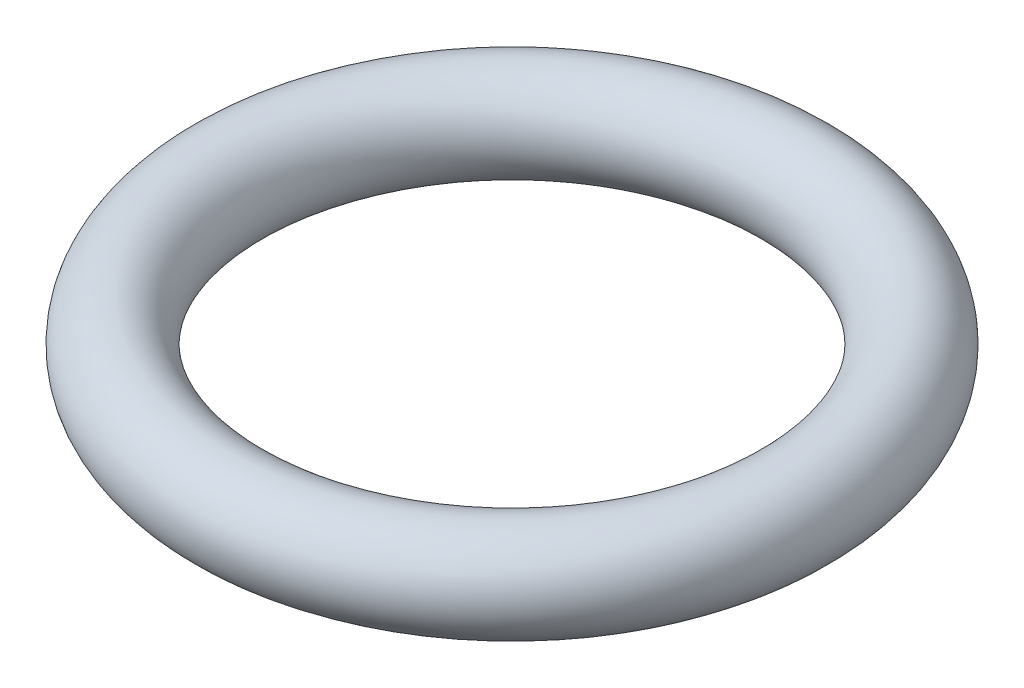
ISO-10303-21;
HEADER;
FILE_DESCRIPTION(('STEP AP214'),'2;1');
FILE_NAME('part.step','',(''),(''),'','','');
FILE_SCHEMA(('AUTOMOTIVE_DESIGN { 1 0 10303 214 1 1 1 1 }'));
ENDSEC;
DATA;
#1=APPLICATION_CONTEXT('core data for automotive mechanical design processes');
#2=APPLICATION_PROTOCOL_DEFINITION('international standard','automotive_design',2000,#1);
#3=PRODUCT_CONTEXT('',#1,'mechanical');
#4=PRODUCT('Part','Part','',(#3));
#5=PRODUCT_RELATED_PRODUCT_CATEGORY('part','',(#4));
#6=PRODUCT_DEFINITION_FORMATION('','',#4);
#7=PRODUCT_DEFINITION_CONTEXT('part definition',#1,'design');
#8=PRODUCT_DEFINITION('design','',#6,#7);
#9=PRODUCT_DEFINITION_SHAPE('','',#8);
#10=(LENGTH_UNIT() NAMED_UNIT(*) SI_UNIT(.MILLI.,.METRE.));
#11=(NAMED_UNIT(*) PLANE_ANGLE_UNIT() SI_UNIT($,.RADIAN.));
#12=(NAMED_UNIT(*) SI_UNIT($,.STERADIAN.) SOLID_ANGLE_UNIT());
#13=UNCERTAINTY_MEASURE_WITH_UNIT(LENGTH_MEASURE(1.E-05),#10,'distance_accuracy_value','');
#14=(GEOMETRIC_REPRESENTATION_CONTEXT(3) GLOBAL_UNCERTAINTY_ASSIGNED_CONTEXT((#13)) GLOBAL_UNIT_ASSIGNED_CONTEXT((#10,
#11,#12)) REPRESENTATION_CONTEXT('',''));
#15=CARTESIAN_POINT('',(0.,0.,0.));
#16=DIRECTION('',(0.,0.,1.));
#17=DIRECTION('',(1.,0.,0.));
#18=AXIS2_PLACEMENT_3D('',#15,#16,#17);
#19=CARTESIAN_POINT('',(0.,0.,0.));
#20=DIRECTION('',(0.,-1.,0.));
#21=DIRECTION('',(0.,0.,-1.));
#22=AXIS2_PLACEMENT_3D('',#19,#20,#21);
#23=TOROIDAL_SURFACE('',#22,152.4,25.4);
#24=CARTESIAN_POINT('',(0.,-24.13,0.));
#25=DIRECTION('',(0.,1.,0.));
#26=DIRECTION('',(0.,0.,1.));
#27=AXIS2_PLACEMENT_3D('',#24,#25,#26);
#28=CIRCLE('',#27,160.331147457966);
#29=CARTESIAN_POINT('',(0.,-24.13,160.331147457966));
#30=VERTEX_POINT('',#29);
#31=EDGE_CURVE('E10',#30,#30,#28,.F.);
#32=ORIENTED_EDGE('',*,*,#31,.F.);
#33=EDGE_LOOP('',(#32));
#34=FACE_BOUND('',#33,.T.);
#35=CARTESIAN_POINT('',(0.,-24.13,0.));
#36=DIRECTION('',(0.,-1.,0.));
#37=DIRECTION('',(0.,0.,-1.));
#38=AXIS2_PLACEMENT_3D('',#35,#36,#37);
#39=CIRCLE('',#38,144.468852542034);
#40=CARTESIAN_POINT('',(0.,-24.13,-144.468852542034));
#41=VERTEX_POINT('',#40);
#42=EDGE_CURVE('E41',#41,#41,#39,.F.);
#43=ORIENTED_EDGE('',*,*,#42,.F.);
#44=EDGE_LOOP('',(#43));
#45=FACE_BOUND('',#44,.T.);
#46=ADVANCED_FACE('F35',(#34,#45),#23,.T.);
#47=CARTESIAN_POINT('',(0.,-24.13,0.));
#48=DIRECTION('',(0.,1.,0.));
#49=DIRECTION('',(0.,0.,1.));
#50=AXIS2_PLACEMENT_3D('',#47,#48,#49);
#51=PLANE('',#50);
#52=ORIENTED_EDGE('',*,*,#31,.T.);
#53=EDGE_LOOP('',(#52));
#54=FACE_BOUND('',#53,.T.);
#55=ORIENTED_EDGE('',*,*,#42,.T.);
#56=EDGE_LOOP('',(#55));
#57=FACE_BOUND('',#56,.T.);
#58=ADVANCED_FACE('F47',(#54,#57),#51,.F.);
#59=CLOSED_SHELL('',(#46,#58));
#60=MANIFOLD_SOLID_BREP('B2',#59);
#61=ADVANCED_BREP_SHAPE_REPRESENTATION('',(#18,#60),#14);
#62=SHAPE_DEFINITION_REPRESENTATION(#9,#61);
ENDSEC;
END-ISO-10303-21;
